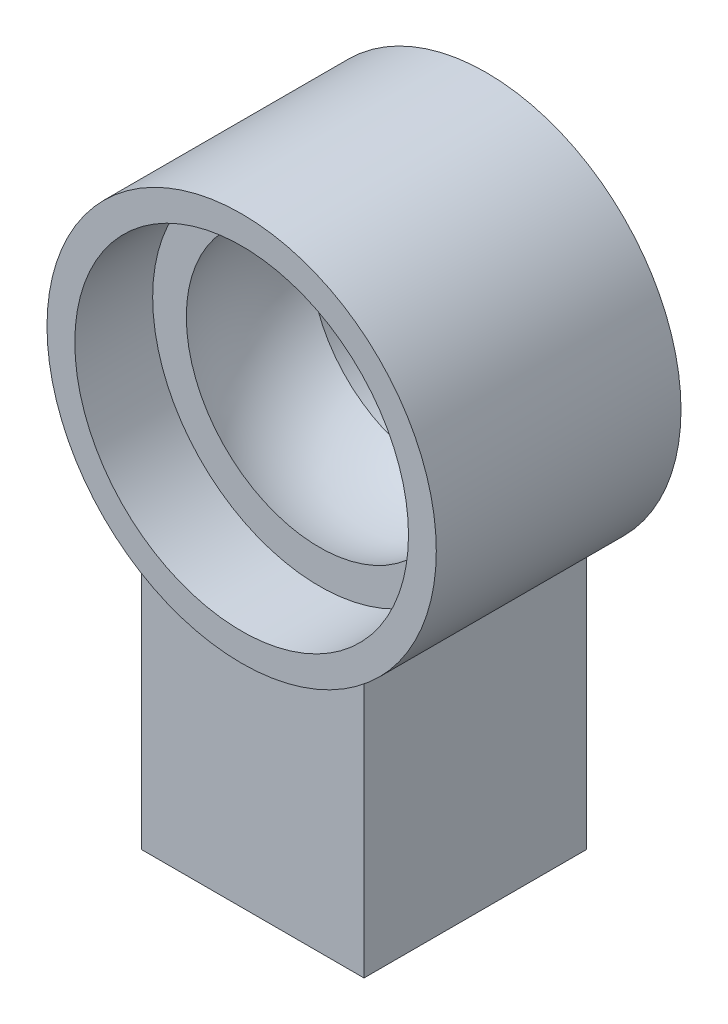
ISO-10303-21;
HEADER;
FILE_DESCRIPTION(('STEP AP214'),'2;1');
FILE_NAME('part.step','',(''),(''),'','','');
FILE_SCHEMA(('AUTOMOTIVE_DESIGN { 1 0 10303 214 1 1 1 1 }'));
ENDSEC;
DATA;
#1=APPLICATION_CONTEXT('core data for automotive mechanical design processes');
#2=APPLICATION_PROTOCOL_DEFINITION('international standard','automotive_design',2000,#1);
#3=PRODUCT_CONTEXT('',#1,'mechanical');
#4=PRODUCT('Part','Part','',(#3));
#5=PRODUCT_RELATED_PRODUCT_CATEGORY('part','',(#4));
#6=PRODUCT_DEFINITION_FORMATION('','',#4);
#7=PRODUCT_DEFINITION_CONTEXT('part definition',#1,'design');
#8=PRODUCT_DEFINITION('design','',#6,#7);
#9=PRODUCT_DEFINITION_SHAPE('','',#8);
#10=(LENGTH_UNIT() NAMED_UNIT(*) SI_UNIT(.MILLI.,.METRE.));
#11=(NAMED_UNIT(*) PLANE_ANGLE_UNIT() SI_UNIT($,.RADIAN.));
#12=(NAMED_UNIT(*) SI_UNIT($,.STERADIAN.) SOLID_ANGLE_UNIT());
#13=UNCERTAINTY_MEASURE_WITH_UNIT(LENGTH_MEASURE(1.E-05),#10,'distance_accuracy_value','');
#14=(GEOMETRIC_REPRESENTATION_CONTEXT(3) GLOBAL_UNCERTAINTY_ASSIGNED_CONTEXT((#13)) GLOBAL_UNIT_ASSIGNED_CONTEXT((#10,
#11,#12)) REPRESENTATION_CONTEXT('',''));
#15=CARTESIAN_POINT('',(0.,0.,0.));
#16=DIRECTION('',(0.,0.,1.));
#17=DIRECTION('',(1.,0.,0.));
#18=AXIS2_PLACEMENT_3D('',#15,#16,#17);
#19=CARTESIAN_POINT('',(0.,0.,0.));
#20=DIRECTION('',(0.,-1.,0.));
#21=DIRECTION('',(1.,0.,0.));
#22=AXIS2_PLACEMENT_3D('',#19,#20,#21);
#23=SPHERICAL_SURFACE('',#22,2.525);
#24=CARTESIAN_POINT('',(0.,0.,0.));
#25=DIRECTION('',(0.,0.,1.));
#26=DIRECTION('',(1.,0.,0.));
#27=AXIS2_PLACEMENT_3D('',#24,#25,#26);
#28=SPHERICAL_SURFACE('',#27,2.525);
#29=CARTESIAN_POINT('',(0.,0.,-1.23920337313937));
#30=DIRECTION('',(0.,0.,1.));
#31=DIRECTION('',(1.,0.,0.));
#32=AXIS2_PLACEMENT_3D('',#29,#30,#31);
#33=CIRCLE('',#32,2.2);
#34=CARTESIAN_POINT('',(2.2,0.,-1.23920337313937));
#35=VERTEX_POINT('',#34);
#36=EDGE_CURVE('E121',#35,#35,#33,.F.);
#37=ORIENTED_EDGE('',*,*,#36,.T.);
#38=EDGE_LOOP('',(#37));
#39=FACE_BOUND('',#38,.T.);
#40=CARTESIAN_POINT('',(0.,0.,0.8));
#41=DIRECTION('',(0.,0.,1.));
#42=DIRECTION('',(1.,0.,0.));
#43=AXIS2_PLACEMENT_3D('',#40,#41,#42);
#44=CIRCLE('',#43,2.39491649123722);
#45=CARTESIAN_POINT('',(2.39491649123722,0.,0.8));
#46=VERTEX_POINT('',#45);
#47=EDGE_CURVE('E44',#46,#46,#44,.F.);
#48=ORIENTED_EDGE('',*,*,#47,.F.);
#49=EDGE_LOOP('',(#48));
#50=FACE_BOUND('',#49,.T.);
#51=ADVANCED_FACE('F41',(#39,#50),#28,.F.);
#52=CARTESIAN_POINT('',(0.,0.,2.2));
#53=DIRECTION('',(0.,0.,-1.));
#54=DIRECTION('',(-1.,0.,0.));
#55=AXIS2_PLACEMENT_3D('',#52,#53,#54);
#56=CYLINDRICAL_SURFACE('',#55,2.2);
#57=ORIENTED_EDGE('',*,*,#36,.F.);
#58=EDGE_LOOP('',(#57));
#59=FACE_BOUND('',#58,.T.);
#60=CARTESIAN_POINT('',(0.,0.,-2.2));
#61=DIRECTION('',(0.,0.,1.));
#62=DIRECTION('',(1.,0.,0.));
#63=AXIS2_PLACEMENT_3D('',#60,#61,#62);
#64=CIRCLE('',#63,2.2);
#65=CARTESIAN_POINT('',(2.2,0.,-2.2));
#66=VERTEX_POINT('',#65);
#67=EDGE_CURVE('E115',#66,#66,#64,.T.);
#68=ORIENTED_EDGE('',*,*,#67,.F.);
#69=EDGE_LOOP('',(#68));
#70=FACE_BOUND('',#69,.T.);
#71=ADVANCED_FACE('F156',(#59,#70),#56,.F.);
#72=CARTESIAN_POINT('',(0.,0.,2.2));
#73=DIRECTION('',(0.,0.,-1.));
#74=DIRECTION('',(-1.,0.,0.));
#75=AXIS2_PLACEMENT_3D('',#72,#73,#74);
#76=CYLINDRICAL_SURFACE('',#75,3.5);
#77=CARTESIAN_POINT('',(0.,0.,-2.2));
#78=DIRECTION('',(0.,0.,1.));
#79=DIRECTION('',(1.,0.,0.));
#80=AXIS2_PLACEMENT_3D('',#77,#78,#79);
#81=CIRCLE('',#80,3.5);
#82=CARTESIAN_POINT('',(3.5,0.,-2.2));
#83=VERTEX_POINT('',#82);
#84=EDGE_CURVE('E112',#83,#83,#81,.T.);
#85=ORIENTED_EDGE('',*,*,#84,.T.);
#86=EDGE_LOOP('',(#85));
#87=FACE_BOUND('',#86,.T.);
#88=CARTESIAN_POINT('',(0.,0.,2.2));
#89=DIRECTION('',(0.,0.,1.));
#90=DIRECTION('',(1.,0.,0.));
#91=AXIS2_PLACEMENT_3D('',#88,#89,#90);
#92=CIRCLE('',#91,3.5);
#93=CARTESIAN_POINT('',(3.5,0.,2.2));
#94=VERTEX_POINT('',#93);
#95=EDGE_CURVE('E116',#94,#94,#92,.T.);
#96=ORIENTED_EDGE('',*,*,#95,.F.);
#97=EDGE_LOOP('',(#96));
#98=FACE_BOUND('',#97,.T.);
#99=CARTESIAN_POINT('',(0.,0.,2.));
#100=DIRECTION('',(0.,0.,-1.));
#101=DIRECTION('',(-1.,0.,0.));
#102=AXIS2_PLACEMENT_3D('',#99,#100,#101);
#103=CIRCLE('',#102,3.5);
#104=CARTESIAN_POINT('',(2.,-2.87228132326901,2.));
#105=VERTEX_POINT('',#104);
#106=CARTESIAN_POINT('',(-2.,-2.87228132326901,2.));
#107=VERTEX_POINT('',#106);
#108=EDGE_CURVE('E86',#105,#107,#103,.T.);
#109=ORIENTED_EDGE('',*,*,#108,.F.);
#110=DIRECTION('',(0.,0.,-1.));
#111=VECTOR('',#110,1.);
#112=CARTESIAN_POINT('',(2.,-2.87228132326901,2.2));
#113=LINE('',#112,#111);
#114=CARTESIAN_POINT('',(2.,-2.87228132326901,-2.));
#115=VERTEX_POINT('',#114);
#116=EDGE_CURVE('E49',#115,#105,#113,.F.);
#117=ORIENTED_EDGE('',*,*,#116,.F.);
#118=CARTESIAN_POINT('',(0.,0.,-2.));
#119=DIRECTION('',(0.,0.,-1.));
#120=DIRECTION('',(-1.,0.,0.));
#121=AXIS2_PLACEMENT_3D('',#118,#119,#120);
#122=CIRCLE('',#121,3.5);
#123=CARTESIAN_POINT('',(-2.,-2.87228132326901,-2.));
#124=VERTEX_POINT('',#123);
#125=EDGE_CURVE('E103',#115,#124,#122,.T.);
#126=ORIENTED_EDGE('',*,*,#125,.T.);
#127=DIRECTION('',(0.,0.,-1.));
#128=VECTOR('',#127,1.);
#129=CARTESIAN_POINT('',(-2.,-2.87228132326901,2.2));
#130=LINE('',#129,#128);
#131=EDGE_CURVE('E11',#107,#124,#130,.T.);
#132=ORIENTED_EDGE('',*,*,#131,.F.);
#133=EDGE_LOOP('',(#109,#117,#126,#132));
#134=FACE_BOUND('',#133,.T.);
#135=ADVANCED_FACE('F43',(#87,#98,#134),#76,.T.);
#136=CARTESIAN_POINT('',(0.,0.,2.2));
#137=DIRECTION('',(0.,0.,1.));
#138=DIRECTION('',(1.,0.,0.));
#139=AXIS2_PLACEMENT_3D('',#136,#137,#138);
#140=PLANE('',#139);
#141=CARTESIAN_POINT('',(0.,0.,2.2));
#142=DIRECTION('',(0.,0.,1.));
#143=DIRECTION('',(1.,0.,0.));
#144=AXIS2_PLACEMENT_3D('',#141,#142,#143);
#145=CIRCLE('',#144,3.);
#146=CARTESIAN_POINT('',(3.,0.,2.2));
#147=VERTEX_POINT('',#146);
#148=EDGE_CURVE('E137',#147,#147,#145,.T.);
#149=ORIENTED_EDGE('',*,*,#148,.F.);
#150=EDGE_LOOP('',(#149));
#151=FACE_BOUND('',#150,.T.);
#152=ORIENTED_EDGE('',*,*,#95,.T.);
#153=EDGE_LOOP('',(#152));
#154=FACE_BOUND('',#153,.T.);
#155=ADVANCED_FACE('F189',(#151,#154),#140,.T.);
#156=CARTESIAN_POINT('',(0.,0.,-2.2));
#157=DIRECTION('',(0.,0.,1.));
#158=DIRECTION('',(1.,0.,0.));
#159=AXIS2_PLACEMENT_3D('',#156,#157,#158);
#160=PLANE('',#159);
#161=ORIENTED_EDGE('',*,*,#84,.F.);
#162=EDGE_LOOP('',(#161));
#163=FACE_BOUND('',#162,.T.);
#164=ORIENTED_EDGE('',*,*,#67,.T.);
#165=EDGE_LOOP('',(#164));
#166=FACE_BOUND('',#165,.T.);
#167=ADVANCED_FACE('F191',(#163,#166),#160,.F.);
#168=CARTESIAN_POINT('',(-2.,-7.5,2.));
#169=DIRECTION('',(1.,0.,0.));
#170=DIRECTION('',(0.,0.,-1.));
#171=AXIS2_PLACEMENT_3D('',#168,#169,#170);
#172=PLANE('',#171);
#173=DIRECTION('',(0.,-1.,0.));
#174=VECTOR('',#173,1.);
#175=CARTESIAN_POINT('',(-2.,-7.5,2.));
#176=LINE('',#175,#174);
#177=CARTESIAN_POINT('',(-2.,-7.5,2.));
#178=VERTEX_POINT('',#177);
#179=EDGE_CURVE('E81',#107,#178,#176,.T.);
#180=ORIENTED_EDGE('',*,*,#179,.F.);
#181=ORIENTED_EDGE('',*,*,#131,.T.);
#182=DIRECTION('',(0.,-1.,0.));
#183=VECTOR('',#182,1.);
#184=CARTESIAN_POINT('',(-2.,-7.5,-2.));
#185=LINE('',#184,#183);
#186=CARTESIAN_POINT('',(-2.,-7.5,-2.));
#187=VERTEX_POINT('',#186);
#188=EDGE_CURVE('E59',#124,#187,#185,.T.);
#189=ORIENTED_EDGE('',*,*,#188,.T.);
#190=DIRECTION('',(0.,0.,-1.));
#191=VECTOR('',#190,1.);
#192=CARTESIAN_POINT('',(-2.,-7.5,2.));
#193=LINE('',#192,#191);
#194=EDGE_CURVE('E97',#178,#187,#193,.T.);
#195=ORIENTED_EDGE('',*,*,#194,.F.);
#196=EDGE_LOOP('',(#180,#181,#189,#195));
#197=FACE_BOUND('',#196,.T.);
#198=ADVANCED_FACE('F102',(#197),#172,.F.);
#199=CARTESIAN_POINT('',(2.,-7.5,2.));
#200=DIRECTION('',(-1.,0.,0.));
#201=DIRECTION('',(0.,0.,1.));
#202=AXIS2_PLACEMENT_3D('',#199,#200,#201);
#203=PLANE('',#202);
#204=DIRECTION('',(0.,1.,0.));
#205=VECTOR('',#204,1.);
#206=CARTESIAN_POINT('',(2.,-7.5,-2.));
#207=LINE('',#206,#205);
#208=CARTESIAN_POINT('',(2.,-7.5,-2.));
#209=VERTEX_POINT('',#208);
#210=EDGE_CURVE('E94',#209,#115,#207,.T.);
#211=ORIENTED_EDGE('',*,*,#210,.T.);
#212=ORIENTED_EDGE('',*,*,#116,.T.);
#213=DIRECTION('',(0.,1.,0.));
#214=VECTOR('',#213,1.);
#215=CARTESIAN_POINT('',(2.,-7.5,2.));
#216=LINE('',#215,#214);
#217=CARTESIAN_POINT('',(2.,-7.5,2.));
#218=VERTEX_POINT('',#217);
#219=EDGE_CURVE('E101',#218,#105,#216,.T.);
#220=ORIENTED_EDGE('',*,*,#219,.F.);
#221=DIRECTION('',(0.,0.,-1.));
#222=VECTOR('',#221,1.);
#223=CARTESIAN_POINT('',(2.,-7.5,2.));
#224=LINE('',#223,#222);
#225=EDGE_CURVE('E96',#218,#209,#224,.T.);
#226=ORIENTED_EDGE('',*,*,#225,.T.);
#227=EDGE_LOOP('',(#211,#212,#220,#226));
#228=FACE_BOUND('',#227,.T.);
#229=ADVANCED_FACE('F142',(#228),#203,.F.);
#230=CARTESIAN_POINT('',(-2.,-7.5,2.));
#231=DIRECTION('',(0.,1.,0.));
#232=DIRECTION('',(0.,0.,1.));
#233=AXIS2_PLACEMENT_3D('',#230,#231,#232);
#234=PLANE('',#233);
#235=CARTESIAN_POINT('',(0.,-7.5,0.));
#236=DIRECTION('',(0.,-1.,0.));
#237=DIRECTION('',(0.,0.,-1.));
#238=AXIS2_PLACEMENT_3D('',#235,#236,#237);
#239=CIRCLE('',#238,1.05);
#240=CARTESIAN_POINT('',(0.,-7.5,-1.05));
#241=VERTEX_POINT('',#240);
#242=EDGE_CURVE('E128',#241,#241,#239,.T.);
#243=ORIENTED_EDGE('',*,*,#242,.F.);
#244=EDGE_LOOP('',(#243));
#245=FACE_BOUND('',#244,.T.);
#246=DIRECTION('',(1.,0.,0.));
#247=VECTOR('',#246,1.);
#248=CARTESIAN_POINT('',(-2.,-7.5,-2.));
#249=LINE('',#248,#247);
#250=EDGE_CURVE('E126',#187,#209,#249,.T.);
#251=ORIENTED_EDGE('',*,*,#250,.T.);
#252=ORIENTED_EDGE('',*,*,#225,.F.);
#253=DIRECTION('',(1.,0.,0.));
#254=VECTOR('',#253,1.);
#255=CARTESIAN_POINT('',(-2.,-7.5,2.));
#256=LINE('',#255,#254);
#257=EDGE_CURVE('E87',#178,#218,#256,.T.);
#258=ORIENTED_EDGE('',*,*,#257,.F.);
#259=ORIENTED_EDGE('',*,*,#194,.T.);
#260=EDGE_LOOP('',(#251,#252,#258,#259));
#261=FACE_BOUND('',#260,.T.);
#262=ADVANCED_FACE('F99',(#245,#261),#234,.F.);
#263=CARTESIAN_POINT('',(0.,0.,2.));
#264=DIRECTION('',(0.,0.,-1.));
#265=DIRECTION('',(-1.,0.,0.));
#266=AXIS2_PLACEMENT_3D('',#263,#264,#265);
#267=PLANE('',#266);
#268=ORIENTED_EDGE('',*,*,#219,.T.);
#269=ORIENTED_EDGE('',*,*,#108,.T.);
#270=ORIENTED_EDGE('',*,*,#179,.T.);
#271=ORIENTED_EDGE('',*,*,#257,.T.);
#272=EDGE_LOOP('',(#268,#269,#270,#271));
#273=FACE_BOUND('',#272,.T.);
#274=ADVANCED_FACE('F83',(#273),#267,.F.);
#275=CARTESIAN_POINT('',(0.,0.,-2.));
#276=DIRECTION('',(0.,0.,-1.));
#277=DIRECTION('',(-1.,0.,0.));
#278=AXIS2_PLACEMENT_3D('',#275,#276,#277);
#279=PLANE('',#278);
#280=ORIENTED_EDGE('',*,*,#125,.F.);
#281=ORIENTED_EDGE('',*,*,#210,.F.);
#282=ORIENTED_EDGE('',*,*,#250,.F.);
#283=ORIENTED_EDGE('',*,*,#188,.F.);
#284=EDGE_LOOP('',(#280,#281,#282,#283));
#285=FACE_BOUND('',#284,.T.);
#286=ADVANCED_FACE('F144',(#285),#279,.T.);
#287=CARTESIAN_POINT('',(0.,-4.8,0.));
#288=DIRECTION('',(0.,-1.,0.));
#289=DIRECTION('',(0.,0.,-1.));
#290=AXIS2_PLACEMENT_3D('',#287,#288,#289);
#291=CYLINDRICAL_SURFACE('',#290,1.05);
#292=CARTESIAN_POINT('',(0.,-4.8,0.));
#293=DIRECTION('',(0.,-1.,0.));
#294=DIRECTION('',(0.,0.,-1.));
#295=AXIS2_PLACEMENT_3D('',#292,#293,#294);
#296=CIRCLE('',#295,1.05);
#297=CARTESIAN_POINT('',(0.,-4.8,-1.05));
#298=VERTEX_POINT('',#297);
#299=EDGE_CURVE('E123',#298,#298,#296,.T.);
#300=CARTESIAN_POINT('',(0.,-4.8,-1.05));
#301=CARTESIAN_POINT('',(0.,-4.828125,-1.05));
#302=CARTESIAN_POINT('',(0.,-4.85625,-1.05));
#303=CARTESIAN_POINT('',(0.,-4.9125,-1.05));
#304=CARTESIAN_POINT('',(0.,-4.940625,-1.05));
#305=CARTESIAN_POINT('',(0.,-4.996875,-1.05));
#306=CARTESIAN_POINT('',(0.,-5.025,-1.05));
#307=CARTESIAN_POINT('',(0.,-5.08125,-1.05));
#308=CARTESIAN_POINT('',(0.,-5.109375,-1.05));
#309=CARTESIAN_POINT('',(0.,-5.165625,-1.05));
#310=CARTESIAN_POINT('',(0.,-5.19375,-1.05));
#311=CARTESIAN_POINT('',(0.,-5.25,-1.05));
#312=CARTESIAN_POINT('',(0.,-5.278125,-1.05));
#313=CARTESIAN_POINT('',(0.,-5.334375,-1.05));
#314=CARTESIAN_POINT('',(0.,-5.3625,-1.05));
#315=CARTESIAN_POINT('',(0.,-5.41875,-1.05));
#316=CARTESIAN_POINT('',(0.,-5.446875,-1.05));
#317=CARTESIAN_POINT('',(0.,-5.503125,-1.05));
#318=CARTESIAN_POINT('',(0.,-5.53125,-1.05));
#319=CARTESIAN_POINT('',(0.,-5.5875,-1.05));
#320=CARTESIAN_POINT('',(0.,-5.615625,-1.05));
#321=CARTESIAN_POINT('',(0.,-5.671875,-1.05));
#322=CARTESIAN_POINT('',(0.,-5.7,-1.05));
#323=CARTESIAN_POINT('',(0.,-5.75625,-1.05));
#324=CARTESIAN_POINT('',(0.,-5.784375,-1.05));
#325=CARTESIAN_POINT('',(0.,-5.840625,-1.05));
#326=CARTESIAN_POINT('',(0.,-5.86875,-1.05));
#327=CARTESIAN_POINT('',(0.,-5.925,-1.05));
#328=CARTESIAN_POINT('',(0.,-5.953125,-1.05));
#329=CARTESIAN_POINT('',(0.,-6.009375,-1.05));
#330=CARTESIAN_POINT('',(0.,-6.0375,-1.05));
#331=CARTESIAN_POINT('',(0.,-6.09375,-1.05));
#332=CARTESIAN_POINT('',(0.,-6.121875,-1.05));
#333=CARTESIAN_POINT('',(0.,-6.178125,-1.05));
#334=CARTESIAN_POINT('',(0.,-6.20625,-1.05));
#335=CARTESIAN_POINT('',(0.,-6.2625,-1.05));
#336=CARTESIAN_POINT('',(0.,-6.290625,-1.05));
#337=CARTESIAN_POINT('',(0.,-6.346875,-1.05));
#338=CARTESIAN_POINT('',(0.,-6.375,-1.05));
#339=CARTESIAN_POINT('',(0.,-6.43125,-1.05));
#340=CARTESIAN_POINT('',(0.,-6.459375,-1.05));
#341=CARTESIAN_POINT('',(0.,-6.515625,-1.05));
#342=CARTESIAN_POINT('',(0.,-6.54375,-1.05));
#343=CARTESIAN_POINT('',(0.,-6.6,-1.05));
#344=CARTESIAN_POINT('',(0.,-6.628125,-1.05));
#345=CARTESIAN_POINT('',(0.,-6.684375,-1.05));
#346=CARTESIAN_POINT('',(0.,-6.7125,-1.05));
#347=CARTESIAN_POINT('',(0.,-6.76875,-1.05));
#348=CARTESIAN_POINT('',(0.,-6.796875,-1.05));
#349=CARTESIAN_POINT('',(0.,-6.853125,-1.05));
#350=CARTESIAN_POINT('',(0.,-6.88125,-1.05));
#351=CARTESIAN_POINT('',(0.,-6.9375,-1.05));
#352=CARTESIAN_POINT('',(0.,-6.965625,-1.05));
#353=CARTESIAN_POINT('',(0.,-7.021875,-1.05));
#354=CARTESIAN_POINT('',(0.,-7.05,-1.05));
#355=CARTESIAN_POINT('',(0.,-7.10625,-1.05));
#356=CARTESIAN_POINT('',(0.,-7.134375,-1.05));
#357=CARTESIAN_POINT('',(0.,-7.190625,-1.05));
#358=CARTESIAN_POINT('',(0.,-7.21875,-1.05));
#359=CARTESIAN_POINT('',(0.,-7.275,-1.05));
#360=CARTESIAN_POINT('',(0.,-7.303125,-1.05));
#361=CARTESIAN_POINT('',(0.,-7.359375,-1.05));
#362=CARTESIAN_POINT('',(0.,-7.3875,-1.05));
#363=CARTESIAN_POINT('',(0.,-7.44375,-1.05));
#364=CARTESIAN_POINT('',(0.,-7.471875,-1.05));
#365=CARTESIAN_POINT('',(0.,-7.5,-1.05));
#366=B_SPLINE_CURVE_WITH_KNOTS('',3,(#300,#301,#302,#303,#304,#305,#306,#307,#308,#309,#310,
#311,#312,#313,#314,#315,#316,#317,#318,#319,#320,#321,#322,#323,#324,#325,#326,#327,#328,#329,
#330,#331,#332,#333,#334,#335,#336,#337,#338,#339,#340,#341,#342,#343,#344,#345,#346,#347,#348,
#349,#350,#351,#352,#353,#354,#355,#356,#357,#358,#359,#360,#361,#362,#363,#364,#365),
.UNSPECIFIED.,.F.,.F.,(4,2,2,2,2,2,2,2,2,2,2,2,2,2,2,2,2,2,2,2,2,2,2,2,2,2,2,2,2,2,2,2,4),(0.,
0.0843749999999994,0.16875,0.253125,0.337499999999999,0.421875,0.50625,0.590625,
0.674999999999999,0.759375,0.84375,0.928124999999999,1.0125,1.096875,1.18125,1.265625,1.35,
1.434375,1.51875,1.603125,1.6875,1.771875,1.85625,1.940625,2.025,2.109375,2.19375,2.278125,
2.3625,2.446875,2.53125,2.615625,2.7),.UNSPECIFIED.);
#367=EDGE_CURVE('BSEAM143',#298,#241,#366,.T.);
#368=ORIENTED_EDGE('',*,*,#299,.F.);
#369=ORIENTED_EDGE('',*,*,#242,.T.);
#370=ORIENTED_EDGE('',*,*,#367,.T.);
#371=ORIENTED_EDGE('',*,*,#367,.F.);
#372=EDGE_LOOP('',(#368,#370,#369,#371));
#373=FACE_BOUND('',#372,.T.);
#374=ADVANCED_FACE('F143',(#373),#291,.F.);
#375=CARTESIAN_POINT('',(0.,-4.8,0.));
#376=DIRECTION('',(0.,-1.,0.));
#377=DIRECTION('',(0.,0.,-1.));
#378=AXIS2_PLACEMENT_3D('',#375,#376,#377);
#379=PLANE('',#378);
#380=ORIENTED_EDGE('',*,*,#299,.T.);
#381=EDGE_LOOP('',(#380));
#382=FACE_BOUND('',#381,.T.);
#383=ADVANCED_FACE('F155',(#382),#379,.T.);
#384=CARTESIAN_POINT('',(0.,0.,0.8));
#385=DIRECTION('',(0.,0.,1.));
#386=DIRECTION('',(1.,0.,0.));
#387=AXIS2_PLACEMENT_3D('',#384,#385,#386);
#388=PLANE('',#387);
#389=CARTESIAN_POINT('',(0.,0.,0.8));
#390=DIRECTION('',(0.,0.,1.));
#391=DIRECTION('',(1.,0.,0.));
#392=AXIS2_PLACEMENT_3D('',#389,#390,#391);
#393=CIRCLE('',#392,3.);
#394=CARTESIAN_POINT('',(3.,0.,0.8));
#395=VERTEX_POINT('',#394);
#396=EDGE_CURVE('E182',#395,#395,#393,.T.);
#397=ORIENTED_EDGE('',*,*,#396,.T.);
#398=EDGE_LOOP('',(#397));
#399=FACE_BOUND('',#398,.T.);
#400=ORIENTED_EDGE('',*,*,#47,.T.);
#401=EDGE_LOOP('',(#400));
#402=FACE_BOUND('',#401,.T.);
#403=ADVANCED_FACE('F168',(#399,#402),#388,.T.);
#404=CARTESIAN_POINT('',(0.,0.,0.8));
#405=DIRECTION('',(0.,0.,1.));
#406=DIRECTION('',(1.,0.,0.));
#407=AXIS2_PLACEMENT_3D('',#404,#405,#406);
#408=CYLINDRICAL_SURFACE('',#407,3.);
#409=ORIENTED_EDGE('',*,*,#396,.F.);
#410=EDGE_LOOP('',(#409));
#411=FACE_BOUND('',#410,.T.);
#412=ORIENTED_EDGE('',*,*,#148,.T.);
#413=EDGE_LOOP('',(#412));
#414=FACE_BOUND('',#413,.T.);
#415=ADVANCED_FACE('F173',(#411,#414),#408,.F.);
#416=CLOSED_SHELL('',(#51,#71,#135,#155,#167,#198,#229,#262,#274,#286,#374,#383,#403,#415));
#417=MANIFOLD_SOLID_BREP('B2',#416);
#418=ADVANCED_BREP_SHAPE_REPRESENTATION('',(#18,#417),#14);
#419=SHAPE_DEFINITION_REPRESENTATION(#9,#418);
ENDSEC;
END-ISO-10303-21;
